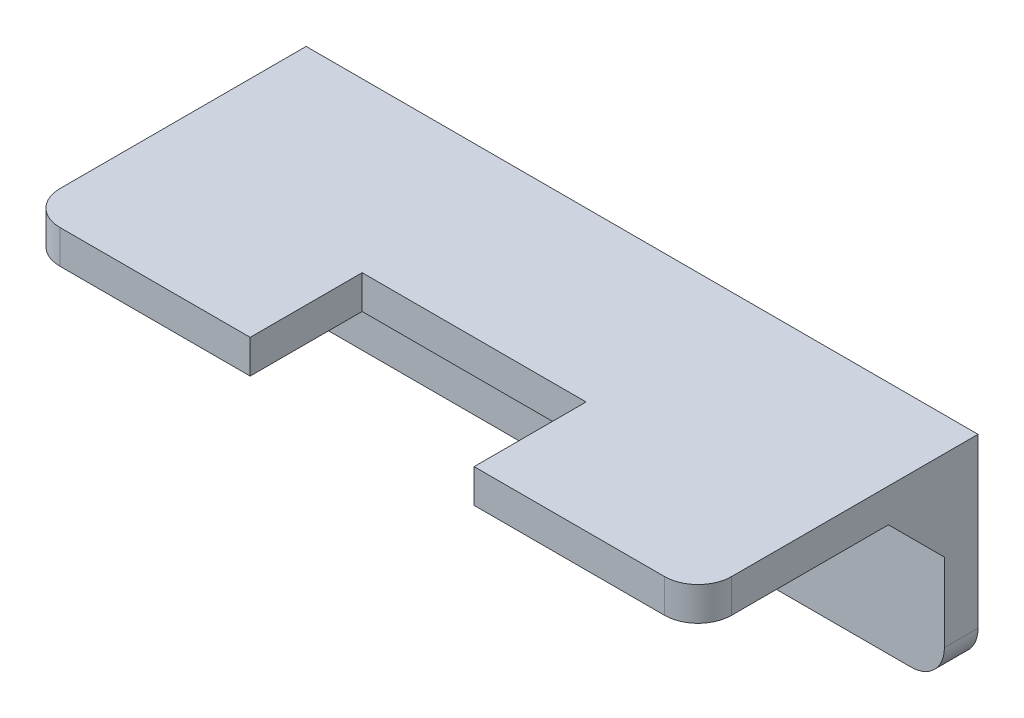
ISO-10303-21;
HEADER;
FILE_DESCRIPTION(('STEP AP214'),'2;1');
FILE_NAME('part.step','',(''),(''),'','','');
FILE_SCHEMA(('AUTOMOTIVE_DESIGN { 1 0 10303 214 1 1 1 1 }'));
ENDSEC;
DATA;
#1=APPLICATION_CONTEXT('core data for automotive mechanical design processes');
#2=APPLICATION_PROTOCOL_DEFINITION('international standard','automotive_design',2000,#1);
#3=PRODUCT_CONTEXT('',#1,'mechanical');
#4=PRODUCT('Part','Part','',(#3));
#5=PRODUCT_RELATED_PRODUCT_CATEGORY('part','',(#4));
#6=PRODUCT_DEFINITION_FORMATION('','',#4);
#7=PRODUCT_DEFINITION_CONTEXT('part definition',#1,'design');
#8=PRODUCT_DEFINITION('design','',#6,#7);
#9=PRODUCT_DEFINITION_SHAPE('','',#8);
#10=(LENGTH_UNIT() NAMED_UNIT(*) SI_UNIT(.MILLI.,.METRE.));
#11=(NAMED_UNIT(*) PLANE_ANGLE_UNIT() SI_UNIT($,.RADIAN.));
#12=(NAMED_UNIT(*) SI_UNIT($,.STERADIAN.) SOLID_ANGLE_UNIT());
#13=UNCERTAINTY_MEASURE_WITH_UNIT(LENGTH_MEASURE(1.E-05),#10,'distance_accuracy_value','');
#14=(GEOMETRIC_REPRESENTATION_CONTEXT(3) GLOBAL_UNCERTAINTY_ASSIGNED_CONTEXT((#13)) GLOBAL_UNIT_ASSIGNED_CONTEXT((#10,
#11,#12)) REPRESENTATION_CONTEXT('',''));
#15=CARTESIAN_POINT('',(0.,0.,0.));
#16=DIRECTION('',(0.,0.,1.));
#17=DIRECTION('',(1.,0.,0.));
#18=AXIS2_PLACEMENT_3D('',#15,#16,#17);
#19=CARTESIAN_POINT('',(0.,0.,25.));
#20=DIRECTION('',(0.,0.,1.));
#21=DIRECTION('',(1.,0.,0.));
#22=AXIS2_PLACEMENT_3D('',#19,#20,#21);
#23=PLANE('',#22);
#24=DIRECTION('',(-1.,0.,0.));
#25=VECTOR('',#24,1.);
#26=CARTESIAN_POINT('',(-30.,160.,25.));
#27=LINE('',#26,#25);
#28=CARTESIAN_POINT('',(-10.,160.,25.));
#29=VERTEX_POINT('',#28);
#30=CARTESIAN_POINT('',(-27.,160.,25.));
#31=VERTEX_POINT('',#30);
#32=EDGE_CURVE('E168',#29,#31,#27,.T.);
#33=ORIENTED_EDGE('',*,*,#32,.T.);
#34=DIRECTION('',(0.,-1.,0.));
#35=VECTOR('',#34,1.);
#36=CARTESIAN_POINT('',(-27.,157.,25.));
#37=LINE('',#36,#35);
#38=CARTESIAN_POINT('',(-27.,157.,25.));
#39=VERTEX_POINT('',#38);
#40=EDGE_CURVE('E249',#31,#39,#37,.T.);
#41=ORIENTED_EDGE('',*,*,#40,.T.);
#42=DIRECTION('',(1.,0.,0.));
#43=VECTOR('',#42,1.);
#44=CARTESIAN_POINT('',(-30.,157.,25.));
#45=LINE('',#44,#43);
#46=CARTESIAN_POINT('',(-10.,157.,25.));
#47=VERTEX_POINT('',#46);
#48=EDGE_CURVE('E195',#39,#47,#45,.T.);
#49=ORIENTED_EDGE('',*,*,#48,.T.);
#50=DIRECTION('',(0.,-1.,0.));
#51=VECTOR('',#50,1.);
#52=CARTESIAN_POINT('',(-10.,160.,25.));
#53=LINE('',#52,#51);
#54=EDGE_CURVE('E177',#29,#47,#53,.T.);
#55=ORIENTED_EDGE('',*,*,#54,.F.);
#56=EDGE_LOOP('',(#33,#41,#49,#55));
#57=FACE_BOUND('',#56,.T.);
#58=ADVANCED_FACE('F35',(#57),#23,.T.);
#59=CARTESIAN_POINT('',(-30.,157.,25.));
#60=DIRECTION('',(0.,1.,0.));
#61=DIRECTION('',(0.,0.,1.));
#62=AXIS2_PLACEMENT_3D('',#59,#60,#61);
#63=PLANE('',#62);
#64=DIRECTION('',(0.,0.,-1.));
#65=VECTOR('',#64,1.);
#66=CARTESIAN_POINT('',(-30.,157.,25.));
#67=LINE('',#66,#65);
#68=CARTESIAN_POINT('',(-30.,157.,22.));
#69=VERTEX_POINT('',#68);
#70=CARTESIAN_POINT('',(-30.,157.,7.99999999999998));
#71=VERTEX_POINT('',#70);
#72=EDGE_CURVE('E214',#69,#71,#67,.T.);
#73=ORIENTED_EDGE('',*,*,#72,.T.);
#74=DIRECTION('',(1.,0.,0.));
#75=VECTOR('',#74,1.);
#76=CARTESIAN_POINT('',(30.,157.,7.99999999999998));
#77=LINE('',#76,#75);
#78=CARTESIAN_POINT('',(30.,157.,7.99999999999998));
#79=VERTEX_POINT('',#78);
#80=EDGE_CURVE('E57',#71,#79,#77,.T.);
#81=ORIENTED_EDGE('',*,*,#80,.T.);
#82=DIRECTION('',(0.,0.,-1.));
#83=VECTOR('',#82,1.);
#84=CARTESIAN_POINT('',(30.,157.,25.));
#85=LINE('',#84,#83);
#86=CARTESIAN_POINT('',(30.,157.,22.));
#87=VERTEX_POINT('',#86);
#88=EDGE_CURVE('E212',#87,#79,#85,.T.);
#89=ORIENTED_EDGE('',*,*,#88,.F.);
#90=CARTESIAN_POINT('',(27.,157.,22.));
#91=DIRECTION('',(0.,1.,0.));
#92=DIRECTION('',(0.,0.,1.));
#93=AXIS2_PLACEMENT_3D('',#90,#91,#92);
#94=CIRCLE('',#93,3.);
#95=CARTESIAN_POINT('',(27.,157.,25.));
#96=VERTEX_POINT('',#95);
#97=EDGE_CURVE('E247',#87,#96,#94,.F.);
#98=ORIENTED_EDGE('',*,*,#97,.T.);
#99=CARTESIAN_POINT('',(9.99999999999999,157.,25.));
#100=VERTEX_POINT('',#99);
#101=EDGE_CURVE('E197',#100,#96,#45,.T.);
#102=ORIENTED_EDGE('',*,*,#101,.F.);
#103=DIRECTION('',(0.,0.,1.));
#104=VECTOR('',#103,1.);
#105=CARTESIAN_POINT('',(10.,157.,25.));
#106=LINE('',#105,#104);
#107=CARTESIAN_POINT('',(10.,157.,15.));
#108=VERTEX_POINT('',#107);
#109=EDGE_CURVE('E169',#108,#100,#106,.T.);
#110=ORIENTED_EDGE('',*,*,#109,.F.);
#111=DIRECTION('',(1.,0.,0.));
#112=VECTOR('',#111,1.);
#113=CARTESIAN_POINT('',(-9.99999999999999,157.,15.));
#114=LINE('',#113,#112);
#115=CARTESIAN_POINT('',(-9.99999999999999,157.,15.));
#116=VERTEX_POINT('',#115);
#117=EDGE_CURVE('E171',#116,#108,#114,.T.);
#118=ORIENTED_EDGE('',*,*,#117,.F.);
#119=DIRECTION('',(0.,0.,-1.));
#120=VECTOR('',#119,1.);
#121=CARTESIAN_POINT('',(-10.,157.,25.));
#122=LINE('',#121,#120);
#123=EDGE_CURVE('E150',#47,#116,#122,.T.);
#124=ORIENTED_EDGE('',*,*,#123,.F.);
#125=ORIENTED_EDGE('',*,*,#48,.F.);
#126=CARTESIAN_POINT('',(-27.,157.,22.));
#127=DIRECTION('',(0.,1.,0.));
#128=DIRECTION('',(0.,0.,1.));
#129=AXIS2_PLACEMENT_3D('',#126,#127,#128);
#130=CIRCLE('',#129,3.);
#131=EDGE_CURVE('E245',#39,#69,#130,.F.);
#132=ORIENTED_EDGE('',*,*,#131,.T.);
#133=EDGE_LOOP('',(#73,#81,#89,#98,#102,#110,#118,#124,#125,#132));
#134=FACE_BOUND('',#133,.T.);
#135=ADVANCED_FACE('F289',(#134),#63,.F.);
#136=CARTESIAN_POINT('',(-30.,160.,25.));
#137=DIRECTION('',(1.,0.,0.));
#138=DIRECTION('',(0.,0.,-1.));
#139=AXIS2_PLACEMENT_3D('',#136,#137,#138);
#140=PLANE('',#139);
#141=DIRECTION('',(0.,-1.,0.));
#142=VECTOR('',#141,1.);
#143=CARTESIAN_POINT('',(-30.,160.,0.));
#144=LINE('',#143,#142);
#145=CARTESIAN_POINT('',(-30.,160.,0.));
#146=VERTEX_POINT('',#145);
#147=CARTESIAN_POINT('',(-30.,145.,0.));
#148=VERTEX_POINT('',#147);
#149=EDGE_CURVE('E194',#146,#148,#144,.T.);
#150=ORIENTED_EDGE('',*,*,#149,.T.);
#151=DIRECTION('',(0.,0.,-1.));
#152=VECTOR('',#151,1.);
#153=CARTESIAN_POINT('',(-30.,145.,25.));
#154=LINE('',#153,#152);
#155=CARTESIAN_POINT('',(-30.,145.,3.));
#156=VERTEX_POINT('',#155);
#157=EDGE_CURVE('E228',#148,#156,#154,.F.);
#158=ORIENTED_EDGE('',*,*,#157,.T.);
#159=DIRECTION('',(0.,1.,0.));
#160=VECTOR('',#159,1.);
#161=CARTESIAN_POINT('',(-30.,142.,3.));
#162=LINE('',#161,#160);
#163=CARTESIAN_POINT('',(-30.,152.,3.));
#164=VERTEX_POINT('',#163);
#165=EDGE_CURVE('E189',#156,#164,#162,.T.);
#166=ORIENTED_EDGE('',*,*,#165,.T.);
#167=DIRECTION('',(0.,-0.707106781186553,-0.707106781186542));
#168=VECTOR('',#167,1.);
#169=CARTESIAN_POINT('',(-30.,167.,17.9999999999999));
#170=LINE('',#169,#168);
#171=EDGE_CURVE('E44',#164,#71,#170,.F.);
#172=ORIENTED_EDGE('',*,*,#171,.T.);
#173=ORIENTED_EDGE('',*,*,#72,.F.);
#174=DIRECTION('',(0.,-1.,0.));
#175=VECTOR('',#174,1.);
#176=CARTESIAN_POINT('',(-30.,160.,22.));
#177=LINE('',#176,#175);
#178=CARTESIAN_POINT('',(-30.,160.,22.));
#179=VERTEX_POINT('',#178);
#180=EDGE_CURVE('E226',#69,#179,#177,.F.);
#181=ORIENTED_EDGE('',*,*,#180,.T.);
#182=DIRECTION('',(0.,0.,-1.));
#183=VECTOR('',#182,1.);
#184=CARTESIAN_POINT('',(-30.,160.,25.));
#185=LINE('',#184,#183);
#186=EDGE_CURVE('E200',#179,#146,#185,.T.);
#187=ORIENTED_EDGE('',*,*,#186,.T.);
#188=EDGE_LOOP('',(#150,#158,#166,#172,#173,#181,#187));
#189=FACE_BOUND('',#188,.T.);
#190=ADVANCED_FACE('F263',(#189),#140,.F.);
#191=CARTESIAN_POINT('',(30.,160.,25.));
#192=DIRECTION('',(-1.,0.,0.));
#193=DIRECTION('',(0.,0.,1.));
#194=AXIS2_PLACEMENT_3D('',#191,#192,#193);
#195=PLANE('',#194);
#196=DIRECTION('',(0.,1.,0.));
#197=VECTOR('',#196,1.);
#198=CARTESIAN_POINT('',(30.,142.,3.));
#199=LINE('',#198,#197);
#200=CARTESIAN_POINT('',(30.,145.,3.));
#201=VERTEX_POINT('',#200);
#202=CARTESIAN_POINT('',(30.,152.,3.));
#203=VERTEX_POINT('',#202);
#204=EDGE_CURVE('E191',#201,#203,#199,.T.);
#205=ORIENTED_EDGE('',*,*,#204,.F.);
#206=DIRECTION('',(0.,0.,1.));
#207=VECTOR('',#206,1.);
#208=CARTESIAN_POINT('',(30.,145.,25.));
#209=LINE('',#208,#207);
#210=CARTESIAN_POINT('',(30.,145.,0.));
#211=VERTEX_POINT('',#210);
#212=EDGE_CURVE('E236',#201,#211,#209,.F.);
#213=ORIENTED_EDGE('',*,*,#212,.T.);
#214=DIRECTION('',(0.,1.,0.));
#215=VECTOR('',#214,1.);
#216=CARTESIAN_POINT('',(30.,160.,0.));
#217=LINE('',#216,#215);
#218=CARTESIAN_POINT('',(30.,160.,0.));
#219=VERTEX_POINT('',#218);
#220=EDGE_CURVE('E203',#211,#219,#217,.T.);
#221=ORIENTED_EDGE('',*,*,#220,.T.);
#222=DIRECTION('',(0.,0.,-1.));
#223=VECTOR('',#222,1.);
#224=CARTESIAN_POINT('',(30.,160.,25.));
#225=LINE('',#224,#223);
#226=CARTESIAN_POINT('',(30.,160.,22.));
#227=VERTEX_POINT('',#226);
#228=EDGE_CURVE('E210',#227,#219,#225,.T.);
#229=ORIENTED_EDGE('',*,*,#228,.F.);
#230=DIRECTION('',(0.,1.,0.));
#231=VECTOR('',#230,1.);
#232=CARTESIAN_POINT('',(30.,157.,22.));
#233=LINE('',#232,#231);
#234=EDGE_CURVE('E234',#227,#87,#233,.F.);
#235=ORIENTED_EDGE('',*,*,#234,.T.);
#236=ORIENTED_EDGE('',*,*,#88,.T.);
#237=DIRECTION('',(0.,0.707106781186553,0.707106781186542));
#238=VECTOR('',#237,1.);
#239=CARTESIAN_POINT('',(30.,167.,17.9999999999999));
#240=LINE('',#239,#238);
#241=EDGE_CURVE('E11',#79,#203,#240,.F.);
#242=ORIENTED_EDGE('',*,*,#241,.T.);
#243=EDGE_LOOP('',(#205,#213,#221,#229,#235,#236,#242));
#244=FACE_BOUND('',#243,.T.);
#245=ADVANCED_FACE('F279',(#244),#195,.F.);
#246=CARTESIAN_POINT('',(-30.,160.,25.));
#247=DIRECTION('',(0.,-1.,0.));
#248=DIRECTION('',(0.,0.,-1.));
#249=AXIS2_PLACEMENT_3D('',#246,#247,#248);
#250=PLANE('',#249);
#251=CARTESIAN_POINT('',(27.,160.,25.));
#252=VERTEX_POINT('',#251);
#253=CARTESIAN_POINT('',(10.,160.,25.));
#254=VERTEX_POINT('',#253);
#255=EDGE_CURVE('E198',#252,#254,#27,.T.);
#256=ORIENTED_EDGE('',*,*,#255,.F.);
#257=CARTESIAN_POINT('',(27.,160.,22.));
#258=DIRECTION('',(0.,-1.,0.));
#259=DIRECTION('',(0.,0.,-1.));
#260=AXIS2_PLACEMENT_3D('',#257,#258,#259);
#261=CIRCLE('',#260,3.);
#262=EDGE_CURVE('E243',#252,#227,#261,.F.);
#263=ORIENTED_EDGE('',*,*,#262,.T.);
#264=ORIENTED_EDGE('',*,*,#228,.T.);
#265=DIRECTION('',(-1.,0.,0.));
#266=VECTOR('',#265,1.);
#267=CARTESIAN_POINT('',(-30.,160.,0.));
#268=LINE('',#267,#266);
#269=EDGE_CURVE('E206',#219,#146,#268,.T.);
#270=ORIENTED_EDGE('',*,*,#269,.T.);
#271=ORIENTED_EDGE('',*,*,#186,.F.);
#272=CARTESIAN_POINT('',(-27.,160.,22.));
#273=DIRECTION('',(0.,-1.,0.));
#274=DIRECTION('',(0.,0.,-1.));
#275=AXIS2_PLACEMENT_3D('',#272,#273,#274);
#276=CIRCLE('',#275,3.);
#277=EDGE_CURVE('E241',#179,#31,#276,.F.);
#278=ORIENTED_EDGE('',*,*,#277,.T.);
#279=ORIENTED_EDGE('',*,*,#32,.F.);
#280=DIRECTION('',(0.,0.,-1.));
#281=VECTOR('',#280,1.);
#282=CARTESIAN_POINT('',(-10.,160.,25.));
#283=LINE('',#282,#281);
#284=CARTESIAN_POINT('',(-9.99999999999999,160.,15.));
#285=VERTEX_POINT('',#284);
#286=EDGE_CURVE('E147',#29,#285,#283,.T.);
#287=ORIENTED_EDGE('',*,*,#286,.T.);
#288=DIRECTION('',(1.,0.,0.));
#289=VECTOR('',#288,1.);
#290=CARTESIAN_POINT('',(-9.99999999999999,160.,15.));
#291=LINE('',#290,#289);
#292=CARTESIAN_POINT('',(10.,160.,15.));
#293=VERTEX_POINT('',#292);
#294=EDGE_CURVE('E158',#285,#293,#291,.T.);
#295=ORIENTED_EDGE('',*,*,#294,.T.);
#296=DIRECTION('',(0.,0.,1.));
#297=VECTOR('',#296,1.);
#298=CARTESIAN_POINT('',(10.,160.,25.));
#299=LINE('',#298,#297);
#300=EDGE_CURVE('E155',#293,#254,#299,.T.);
#301=ORIENTED_EDGE('',*,*,#300,.T.);
#302=EDGE_LOOP('',(#256,#263,#264,#270,#271,#278,#279,#287,#295,#301));
#303=FACE_BOUND('',#302,.T.);
#304=ADVANCED_FACE('F166',(#303),#250,.F.);
#305=ORIENTED_EDGE('',*,*,#101,.T.);
#306=DIRECTION('',(0.,1.,0.));
#307=VECTOR('',#306,1.);
#308=CARTESIAN_POINT('',(27.,160.,25.));
#309=LINE('',#308,#307);
#310=EDGE_CURVE('E238',#96,#252,#309,.T.);
#311=ORIENTED_EDGE('',*,*,#310,.T.);
#312=ORIENTED_EDGE('',*,*,#255,.T.);
#313=DIRECTION('',(0.,-1.,0.));
#314=VECTOR('',#313,1.);
#315=CARTESIAN_POINT('',(10.,160.,25.));
#316=LINE('',#315,#314);
#317=EDGE_CURVE('E180',#254,#100,#316,.T.);
#318=ORIENTED_EDGE('',*,*,#317,.T.);
#319=EDGE_LOOP('',(#305,#311,#312,#318));
#320=FACE_BOUND('',#319,.T.);
#321=ADVANCED_FACE('F292',(#320),#23,.T.);
#322=CARTESIAN_POINT('',(0.,0.,0.));
#323=DIRECTION('',(0.,0.,1.));
#324=DIRECTION('',(1.,0.,0.));
#325=AXIS2_PLACEMENT_3D('',#322,#323,#324);
#326=PLANE('',#325);
#327=DIRECTION('',(1.,0.,0.));
#328=VECTOR('',#327,1.);
#329=CARTESIAN_POINT('',(-30.,142.,0.));
#330=LINE('',#329,#328);
#331=CARTESIAN_POINT('',(-27.,142.,0.));
#332=VERTEX_POINT('',#331);
#333=CARTESIAN_POINT('',(27.,142.,0.));
#334=VERTEX_POINT('',#333);
#335=EDGE_CURVE('E179',#332,#334,#330,.T.);
#336=ORIENTED_EDGE('',*,*,#335,.F.);
#337=CARTESIAN_POINT('',(-27.,145.,0.));
#338=DIRECTION('',(0.,0.,1.));
#339=DIRECTION('',(1.,0.,0.));
#340=AXIS2_PLACEMENT_3D('',#337,#338,#339);
#341=CIRCLE('',#340,3.);
#342=EDGE_CURVE('E224',#332,#148,#341,.F.);
#343=ORIENTED_EDGE('',*,*,#342,.T.);
#344=ORIENTED_EDGE('',*,*,#149,.F.);
#345=ORIENTED_EDGE('',*,*,#269,.F.);
#346=ORIENTED_EDGE('',*,*,#220,.F.);
#347=CARTESIAN_POINT('',(27.,145.,0.));
#348=DIRECTION('',(0.,0.,1.));
#349=DIRECTION('',(1.,0.,0.));
#350=AXIS2_PLACEMENT_3D('',#347,#348,#349);
#351=CIRCLE('',#350,3.);
#352=EDGE_CURVE('E222',#211,#334,#351,.F.);
#353=ORIENTED_EDGE('',*,*,#352,.T.);
#354=EDGE_LOOP('',(#336,#343,#344,#345,#346,#353));
#355=FACE_BOUND('',#354,.T.);
#356=ADVANCED_FACE('F300',(#355),#326,.F.);
#357=CARTESIAN_POINT('',(-30.,142.,3.));
#358=DIRECTION('',(0.,0.,-1.));
#359=DIRECTION('',(-1.,0.,0.));
#360=AXIS2_PLACEMENT_3D('',#357,#358,#359);
#361=PLANE('',#360);
#362=ORIENTED_EDGE('',*,*,#204,.T.);
#363=DIRECTION('',(-1.,0.,0.));
#364=VECTOR('',#363,1.);
#365=CARTESIAN_POINT('',(-30.,152.,3.));
#366=LINE('',#365,#364);
#367=EDGE_CURVE('E252',#203,#164,#366,.T.);
#368=ORIENTED_EDGE('',*,*,#367,.T.);
#369=ORIENTED_EDGE('',*,*,#165,.F.);
#370=CARTESIAN_POINT('',(-27.,145.,3.));
#371=DIRECTION('',(0.,0.,-1.));
#372=DIRECTION('',(-1.,0.,0.));
#373=AXIS2_PLACEMENT_3D('',#370,#371,#372);
#374=CIRCLE('',#373,3.);
#375=CARTESIAN_POINT('',(-27.,142.,3.));
#376=VERTEX_POINT('',#375);
#377=EDGE_CURVE('E232',#156,#376,#374,.F.);
#378=ORIENTED_EDGE('',*,*,#377,.T.);
#379=DIRECTION('',(-1.,0.,0.));
#380=VECTOR('',#379,1.);
#381=CARTESIAN_POINT('',(-30.,142.,3.));
#382=LINE('',#381,#380);
#383=CARTESIAN_POINT('',(27.,142.,3.));
#384=VERTEX_POINT('',#383);
#385=EDGE_CURVE('E186',#384,#376,#382,.T.);
#386=ORIENTED_EDGE('',*,*,#385,.F.);
#387=CARTESIAN_POINT('',(27.,145.,3.));
#388=DIRECTION('',(0.,0.,-1.));
#389=DIRECTION('',(-1.,0.,0.));
#390=AXIS2_PLACEMENT_3D('',#387,#388,#389);
#391=CIRCLE('',#390,3.);
#392=EDGE_CURVE('E230',#384,#201,#391,.F.);
#393=ORIENTED_EDGE('',*,*,#392,.T.);
#394=EDGE_LOOP('',(#362,#368,#369,#378,#386,#393));
#395=FACE_BOUND('',#394,.T.);
#396=ADVANCED_FACE('F258',(#395),#361,.F.);
#397=CARTESIAN_POINT('',(0.,142.,0.));
#398=DIRECTION('',(0.,1.,0.));
#399=DIRECTION('',(0.,0.,1.));
#400=AXIS2_PLACEMENT_3D('',#397,#398,#399);
#401=PLANE('',#400);
#402=ORIENTED_EDGE('',*,*,#385,.T.);
#403=DIRECTION('',(0.,0.,-1.));
#404=VECTOR('',#403,1.);
#405=CARTESIAN_POINT('',(-27.,142.,0.));
#406=LINE('',#405,#404);
#407=EDGE_CURVE('E219',#376,#332,#406,.T.);
#408=ORIENTED_EDGE('',*,*,#407,.T.);
#409=ORIENTED_EDGE('',*,*,#335,.T.);
#410=DIRECTION('',(0.,0.,1.));
#411=VECTOR('',#410,1.);
#412=CARTESIAN_POINT('',(27.,142.,0.));
#413=LINE('',#412,#411);
#414=EDGE_CURVE('E216',#334,#384,#413,.T.);
#415=ORIENTED_EDGE('',*,*,#414,.T.);
#416=EDGE_LOOP('',(#402,#408,#409,#415));
#417=FACE_BOUND('',#416,.T.);
#418=ADVANCED_FACE('F271',(#417),#401,.F.);
#419=CARTESIAN_POINT('',(-10.,160.,25.));
#420=DIRECTION('',(-1.,0.,0.));
#421=DIRECTION('',(0.,0.,1.));
#422=AXIS2_PLACEMENT_3D('',#419,#420,#421);
#423=PLANE('',#422);
#424=ORIENTED_EDGE('',*,*,#123,.T.);
#425=DIRECTION('',(0.,-1.,0.));
#426=VECTOR('',#425,1.);
#427=CARTESIAN_POINT('',(-9.99999999999999,160.,15.));
#428=LINE('',#427,#426);
#429=EDGE_CURVE('E142',#285,#116,#428,.T.);
#430=ORIENTED_EDGE('',*,*,#429,.F.);
#431=ORIENTED_EDGE('',*,*,#286,.F.);
#432=ORIENTED_EDGE('',*,*,#54,.T.);
#433=EDGE_LOOP('',(#424,#430,#431,#432));
#434=FACE_BOUND('',#433,.T.);
#435=ADVANCED_FACE('F144',(#434),#423,.F.);
#436=CARTESIAN_POINT('',(10.,160.,25.));
#437=DIRECTION('',(1.,0.,0.));
#438=DIRECTION('',(0.,0.,-1.));
#439=AXIS2_PLACEMENT_3D('',#436,#437,#438);
#440=PLANE('',#439);
#441=ORIENTED_EDGE('',*,*,#109,.T.);
#442=ORIENTED_EDGE('',*,*,#317,.F.);
#443=ORIENTED_EDGE('',*,*,#300,.F.);
#444=DIRECTION('',(0.,-1.,0.));
#445=VECTOR('',#444,1.);
#446=CARTESIAN_POINT('',(10.,160.,15.));
#447=LINE('',#446,#445);
#448=EDGE_CURVE('E154',#293,#108,#447,.T.);
#449=ORIENTED_EDGE('',*,*,#448,.T.);
#450=EDGE_LOOP('',(#441,#442,#443,#449));
#451=FACE_BOUND('',#450,.T.);
#452=ADVANCED_FACE('F324',(#451),#440,.F.);
#453=CARTESIAN_POINT('',(-9.99999999999999,160.,15.));
#454=DIRECTION('',(0.,0.,-1.));
#455=DIRECTION('',(-1.,0.,0.));
#456=AXIS2_PLACEMENT_3D('',#453,#454,#455);
#457=PLANE('',#456);
#458=ORIENTED_EDGE('',*,*,#117,.T.);
#459=ORIENTED_EDGE('',*,*,#448,.F.);
#460=ORIENTED_EDGE('',*,*,#294,.F.);
#461=ORIENTED_EDGE('',*,*,#429,.T.);
#462=EDGE_LOOP('',(#458,#459,#460,#461));
#463=FACE_BOUND('',#462,.T.);
#464=ADVANCED_FACE('F159',(#463),#457,.F.);
#465=CARTESIAN_POINT('',(-27.,145.,0.));
#466=DIRECTION('',(0.,0.,-1.));
#467=DIRECTION('',(-1.,0.,0.));
#468=AXIS2_PLACEMENT_3D('',#465,#466,#467);
#469=CYLINDRICAL_SURFACE('',#468,3.);
#470=ORIENTED_EDGE('',*,*,#377,.F.);
#471=ORIENTED_EDGE('',*,*,#157,.F.);
#472=ORIENTED_EDGE('',*,*,#342,.F.);
#473=ORIENTED_EDGE('',*,*,#407,.F.);
#474=EDGE_LOOP('',(#470,#471,#472,#473));
#475=FACE_BOUND('',#474,.T.);
#476=ADVANCED_FACE('F267',(#475),#469,.T.);
#477=CARTESIAN_POINT('',(27.,145.,0.));
#478=DIRECTION('',(0.,0.,1.));
#479=DIRECTION('',(1.,0.,0.));
#480=AXIS2_PLACEMENT_3D('',#477,#478,#479);
#481=CYLINDRICAL_SURFACE('',#480,3.);
#482=ORIENTED_EDGE('',*,*,#352,.F.);
#483=ORIENTED_EDGE('',*,*,#212,.F.);
#484=ORIENTED_EDGE('',*,*,#392,.F.);
#485=ORIENTED_EDGE('',*,*,#414,.F.);
#486=EDGE_LOOP('',(#482,#483,#484,#485));
#487=FACE_BOUND('',#486,.T.);
#488=ADVANCED_FACE('F276',(#487),#481,.T.);
#489=CARTESIAN_POINT('',(27.,0.,22.));
#490=DIRECTION('',(0.,-1.,0.));
#491=DIRECTION('',(0.,0.,-1.));
#492=AXIS2_PLACEMENT_3D('',#489,#490,#491);
#493=CYLINDRICAL_SURFACE('',#492,3.);
#494=ORIENTED_EDGE('',*,*,#97,.F.);
#495=ORIENTED_EDGE('',*,*,#234,.F.);
#496=ORIENTED_EDGE('',*,*,#262,.F.);
#497=ORIENTED_EDGE('',*,*,#310,.F.);
#498=EDGE_LOOP('',(#494,#495,#496,#497));
#499=FACE_BOUND('',#498,.T.);
#500=ADVANCED_FACE('F286',(#499),#493,.T.);
#501=CARTESIAN_POINT('',(-27.,0.,22.));
#502=DIRECTION('',(0.,1.,0.));
#503=DIRECTION('',(0.,0.,1.));
#504=AXIS2_PLACEMENT_3D('',#501,#502,#503);
#505=CYLINDRICAL_SURFACE('',#504,3.);
#506=ORIENTED_EDGE('',*,*,#277,.F.);
#507=ORIENTED_EDGE('',*,*,#180,.F.);
#508=ORIENTED_EDGE('',*,*,#131,.F.);
#509=ORIENTED_EDGE('',*,*,#40,.F.);
#510=EDGE_LOOP('',(#506,#507,#508,#509));
#511=FACE_BOUND('',#510,.T.);
#512=ADVANCED_FACE('F282',(#511),#505,.T.);
#513=CARTESIAN_POINT('',(-30.,152.,3.));
#514=DIRECTION('',(0.,-0.707106781186542,0.707106781186553));
#515=DIRECTION('',(1.,0.,0.));
#516=AXIS2_PLACEMENT_3D('',#513,#514,#515);
#517=PLANE('',#516);
#518=ORIENTED_EDGE('',*,*,#241,.F.);
#519=ORIENTED_EDGE('',*,*,#80,.F.);
#520=ORIENTED_EDGE('',*,*,#171,.F.);
#521=ORIENTED_EDGE('',*,*,#367,.F.);
#522=EDGE_LOOP('',(#518,#519,#520,#521));
#523=FACE_BOUND('',#522,.T.);
#524=ADVANCED_FACE('F38',(#523),#517,.T.);
#525=CLOSED_SHELL('',(#58,#135,#190,#245,#304,#321,#356,#396,#418,#435,#452,#464,#476,#488,#500,
#512,#524));
#526=MANIFOLD_SOLID_BREP('B2',#525);
#527=ADVANCED_BREP_SHAPE_REPRESENTATION('',(#18,#526),#14);
#528=SHAPE_DEFINITION_REPRESENTATION(#9,#527);
ENDSEC;
END-ISO-10303-21;
